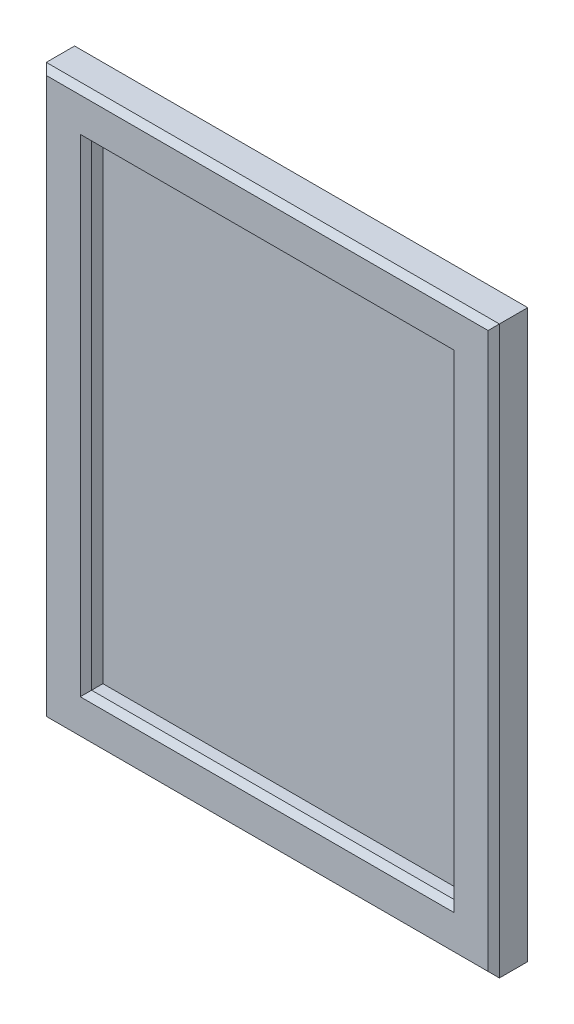
ISO-10303-21;
HEADER;
FILE_DESCRIPTION(('STEP AP214'),'2;1');
FILE_NAME('part.step','',(''),(''),'','','');
FILE_SCHEMA(('AUTOMOTIVE_DESIGN { 1 0 10303 214 1 1 1 1 }'));
ENDSEC;
DATA;
#1=APPLICATION_CONTEXT('core data for automotive mechanical design processes');
#2=APPLICATION_PROTOCOL_DEFINITION('international standard','automotive_design',2000,#1);
#3=PRODUCT_CONTEXT('',#1,'mechanical');
#4=PRODUCT('Part','Part','',(#3));
#5=PRODUCT_RELATED_PRODUCT_CATEGORY('part','',(#4));
#6=PRODUCT_DEFINITION_FORMATION('','',#4);
#7=PRODUCT_DEFINITION_CONTEXT('part definition',#1,'design');
#8=PRODUCT_DEFINITION('design','',#6,#7);
#9=PRODUCT_DEFINITION_SHAPE('','',#8);
#10=(LENGTH_UNIT() NAMED_UNIT(*) SI_UNIT(.MILLI.,.METRE.));
#11=(NAMED_UNIT(*) PLANE_ANGLE_UNIT() SI_UNIT($,.RADIAN.));
#12=(NAMED_UNIT(*) SI_UNIT($,.STERADIAN.) SOLID_ANGLE_UNIT());
#13=UNCERTAINTY_MEASURE_WITH_UNIT(LENGTH_MEASURE(1.E-05),#10,'distance_accuracy_value','');
#14=(GEOMETRIC_REPRESENTATION_CONTEXT(3) GLOBAL_UNCERTAINTY_ASSIGNED_CONTEXT((#13)) GLOBAL_UNIT_ASSIGNED_CONTEXT((#10,
#11,#12)) REPRESENTATION_CONTEXT('',''));
#15=CARTESIAN_POINT('',(0.,0.,0.));
#16=DIRECTION('',(0.,0.,1.));
#17=DIRECTION('',(1.,0.,0.));
#18=AXIS2_PLACEMENT_3D('',#15,#16,#17);
#19=CARTESIAN_POINT('',(737.309711458083,953.456875401663,30.));
#20=DIRECTION('',(1.,0.,0.));
#21=DIRECTION('',(0.,1.,0.));
#22=AXIS2_PLACEMENT_3D('',#19,#20,#21);
#23=PLANE('',#22);
#24=DIRECTION('',(0.,-1.,0.));
#25=VECTOR('',#24,1.);
#26=CARTESIAN_POINT('',(737.309711458083,953.456875401663,20.));
#27=LINE('',#26,#25);
#28=CARTESIAN_POINT('',(737.309711458083,953.456875401663,20.));
#29=VERTEX_POINT('',#28);
#30=CARTESIAN_POINT('',(737.309711458083,37.5133814701847,20.));
#31=VERTEX_POINT('',#30);
#32=EDGE_CURVE('E119',#29,#31,#27,.T.);
#33=ORIENTED_EDGE('',*,*,#32,.F.);
#34=DIRECTION('',(0.,0.,-1.));
#35=VECTOR('',#34,1.);
#36=CARTESIAN_POINT('',(737.309711458083,953.456875401663,30.));
#37=LINE('',#36,#35);
#38=CARTESIAN_POINT('',(737.309711458083,953.456875401663,30.));
#39=VERTEX_POINT('',#38);
#40=EDGE_CURVE('E12',#39,#29,#37,.T.);
#41=ORIENTED_EDGE('',*,*,#40,.F.);
#42=DIRECTION('',(0.,-1.,0.));
#43=VECTOR('',#42,1.);
#44=CARTESIAN_POINT('',(737.309711458083,953.456875401663,30.));
#45=LINE('',#44,#43);
#46=CARTESIAN_POINT('',(737.309711458083,37.5133814701847,30.));
#47=VERTEX_POINT('',#46);
#48=EDGE_CURVE('E113',#39,#47,#45,.T.);
#49=ORIENTED_EDGE('',*,*,#48,.T.);
#50=DIRECTION('',(0.,0.,-1.));
#51=VECTOR('',#50,1.);
#52=CARTESIAN_POINT('',(737.309711458083,37.5133814701847,30.));
#53=LINE('',#52,#51);
#54=EDGE_CURVE('E58',#47,#31,#53,.T.);
#55=ORIENTED_EDGE('',*,*,#54,.T.);
#56=EDGE_LOOP('',(#33,#41,#49,#55));
#57=FACE_BOUND('',#56,.T.);
#58=ADVANCED_FACE('F55',(#57),#23,.T.);
#59=CARTESIAN_POINT('',(737.309711458083,953.456875401663,30.));
#60=DIRECTION('',(0.,1.,0.));
#61=DIRECTION('',(0.,0.,1.));
#62=AXIS2_PLACEMENT_3D('',#59,#60,#61);
#63=PLANE('',#62);
#64=DIRECTION('',(1.,0.,0.));
#65=VECTOR('',#64,1.);
#66=CARTESIAN_POINT('',(737.309711458083,953.456875401663,20.));
#67=LINE('',#66,#65);
#68=CARTESIAN_POINT('',(41.8597438026764,953.456875401663,20.));
#69=VERTEX_POINT('',#68);
#70=EDGE_CURVE('E115',#69,#29,#67,.T.);
#71=ORIENTED_EDGE('',*,*,#70,.F.);
#72=DIRECTION('',(0.,0.,-1.));
#73=VECTOR('',#72,1.);
#74=CARTESIAN_POINT('',(41.8597438026764,953.456875401663,30.));
#75=LINE('',#74,#73);
#76=CARTESIAN_POINT('',(41.8597438026764,953.456875401663,30.));
#77=VERTEX_POINT('',#76);
#78=EDGE_CURVE('E64',#77,#69,#75,.T.);
#79=ORIENTED_EDGE('',*,*,#78,.F.);
#80=DIRECTION('',(1.,0.,0.));
#81=VECTOR('',#80,1.);
#82=CARTESIAN_POINT('',(737.309711458083,953.456875401663,30.));
#83=LINE('',#82,#81);
#84=EDGE_CURVE('E110',#77,#39,#83,.T.);
#85=ORIENTED_EDGE('',*,*,#84,.T.);
#86=ORIENTED_EDGE('',*,*,#40,.T.);
#87=EDGE_LOOP('',(#71,#79,#85,#86));
#88=FACE_BOUND('',#87,.T.);
#89=ADVANCED_FACE('F129',(#88),#63,.T.);
#90=CARTESIAN_POINT('',(41.8597438026764,953.456875401663,30.));
#91=DIRECTION('',(-1.,0.,0.));
#92=DIRECTION('',(0.,0.,1.));
#93=AXIS2_PLACEMENT_3D('',#90,#91,#92);
#94=PLANE('',#93);
#95=DIRECTION('',(0.,1.,0.));
#96=VECTOR('',#95,1.);
#97=CARTESIAN_POINT('',(41.8597438026764,953.456875401663,20.));
#98=LINE('',#97,#96);
#99=CARTESIAN_POINT('',(41.8597438026764,37.5133814701847,20.));
#100=VERTEX_POINT('',#99);
#101=EDGE_CURVE('E105',#100,#69,#98,.T.);
#102=ORIENTED_EDGE('',*,*,#101,.F.);
#103=DIRECTION('',(0.,0.,-1.));
#104=VECTOR('',#103,1.);
#105=CARTESIAN_POINT('',(41.8597438026764,37.5133814701847,30.));
#106=LINE('',#105,#104);
#107=CARTESIAN_POINT('',(41.8597438026764,37.5133814701847,30.));
#108=VERTEX_POINT('',#107);
#109=EDGE_CURVE('E100',#108,#100,#106,.T.);
#110=ORIENTED_EDGE('',*,*,#109,.F.);
#111=DIRECTION('',(0.,1.,0.));
#112=VECTOR('',#111,1.);
#113=CARTESIAN_POINT('',(41.8597438026764,953.456875401663,30.));
#114=LINE('',#113,#112);
#115=EDGE_CURVE('E103',#108,#77,#114,.T.);
#116=ORIENTED_EDGE('',*,*,#115,.T.);
#117=ORIENTED_EDGE('',*,*,#78,.T.);
#118=EDGE_LOOP('',(#102,#110,#116,#117));
#119=FACE_BOUND('',#118,.T.);
#120=ADVANCED_FACE('F102',(#119),#94,.T.);
#121=CARTESIAN_POINT('',(737.309711458083,37.5133814701847,30.));
#122=DIRECTION('',(0.,-1.,0.));
#123=DIRECTION('',(0.,0.,-1.));
#124=AXIS2_PLACEMENT_3D('',#121,#122,#123);
#125=PLANE('',#124);
#126=DIRECTION('',(-1.,0.,0.));
#127=VECTOR('',#126,1.);
#128=CARTESIAN_POINT('',(737.309711458083,37.5133814701847,20.));
#129=LINE('',#128,#127);
#130=EDGE_CURVE('E122',#31,#100,#129,.T.);
#131=ORIENTED_EDGE('',*,*,#130,.F.);
#132=ORIENTED_EDGE('',*,*,#54,.F.);
#133=DIRECTION('',(-1.,0.,0.));
#134=VECTOR('',#133,1.);
#135=CARTESIAN_POINT('',(737.309711458083,37.5133814701847,30.));
#136=LINE('',#135,#134);
#137=EDGE_CURVE('E109',#47,#108,#136,.T.);
#138=ORIENTED_EDGE('',*,*,#137,.T.);
#139=ORIENTED_EDGE('',*,*,#109,.T.);
#140=EDGE_LOOP('',(#131,#132,#138,#139));
#141=FACE_BOUND('',#140,.T.);
#142=ADVANCED_FACE('F112',(#141),#125,.T.);
#143=CARTESIAN_POINT('',(0.,0.,30.));
#144=DIRECTION('',(0.,0.,-1.));
#145=DIRECTION('',(-1.,0.,0.));
#146=AXIS2_PLACEMENT_3D('',#143,#144,#145);
#147=PLANE('',#146);
#148=ORIENTED_EDGE('',*,*,#48,.F.);
#149=ORIENTED_EDGE('',*,*,#84,.F.);
#150=ORIENTED_EDGE('',*,*,#115,.F.);
#151=ORIENTED_EDGE('',*,*,#137,.F.);
#152=EDGE_LOOP('',(#148,#149,#150,#151));
#153=FACE_BOUND('',#152,.T.);
#154=ADVANCED_FACE('F108',(#153),#147,.F.);
#155=CARTESIAN_POINT('',(0.,0.,20.));
#156=DIRECTION('',(0.,0.,-1.));
#157=DIRECTION('',(-1.,0.,0.));
#158=AXIS2_PLACEMENT_3D('',#155,#156,#157);
#159=PLANE('',#158);
#160=ORIENTED_EDGE('',*,*,#32,.T.);
#161=ORIENTED_EDGE('',*,*,#130,.T.);
#162=ORIENTED_EDGE('',*,*,#101,.T.);
#163=ORIENTED_EDGE('',*,*,#70,.T.);
#164=EDGE_LOOP('',(#160,#161,#162,#163));
#165=FACE_BOUND('',#164,.T.);
#166=ADVANCED_FACE('F128',(#165),#159,.T.);
#167=CLOSED_SHELL('',(#58,#89,#120,#142,#154,#166));
#168=MANIFOLD_SOLID_BREP('B2',#167);
#169=CARTESIAN_POINT('',(0.,0.,60.));
#170=DIRECTION('',(0.,0.,-1.));
#171=DIRECTION('',(-1.,0.,0.));
#172=AXIS2_PLACEMENT_3D('',#169,#170,#171);
#173=PLANE('',#172);
#174=DIRECTION('',(1.,0.,0.));
#175=VECTOR('',#174,1.);
#176=CARTESIAN_POINT('',(720.,930.,60.));
#177=LINE('',#176,#175);
#178=CARTESIAN_POINT('',(69.9999999999998,930.,60.));
#179=VERTEX_POINT('',#178);
#180=CARTESIAN_POINT('',(730.,930.,60.));
#181=VERTEX_POINT('',#180);
#182=EDGE_CURVE('E344',#179,#181,#177,.T.);
#183=ORIENTED_EDGE('',*,*,#182,.T.);
#184=DIRECTION('',(0.,-1.,0.));
#185=VECTOR('',#184,1.);
#186=CARTESIAN_POINT('',(730.,80.,60.));
#187=LINE('',#186,#185);
#188=CARTESIAN_POINT('',(730.,69.9999999999998,60.));
#189=VERTEX_POINT('',#188);
#190=EDGE_CURVE('E346',#181,#189,#187,.T.);
#191=ORIENTED_EDGE('',*,*,#190,.T.);
#192=DIRECTION('',(-1.,0.,0.));
#193=VECTOR('',#192,1.);
#194=CARTESIAN_POINT('',(80.,69.9999999999998,60.));
#195=LINE('',#194,#193);
#196=CARTESIAN_POINT('',(69.9999999999998,69.9999999999998,60.));
#197=VERTEX_POINT('',#196);
#198=EDGE_CURVE('E340',#189,#197,#195,.T.);
#199=ORIENTED_EDGE('',*,*,#198,.T.);
#200=DIRECTION('',(0.,1.,0.));
#201=VECTOR('',#200,1.);
#202=CARTESIAN_POINT('',(69.9999999999998,920.,60.));
#203=LINE('',#202,#201);
#204=EDGE_CURVE('E342',#197,#179,#203,.T.);
#205=ORIENTED_EDGE('',*,*,#204,.T.);
#206=EDGE_LOOP('',(#183,#191,#199,#205));
#207=FACE_BOUND('',#206,.T.);
#208=DIRECTION('',(0.,1.,0.));
#209=VECTOR('',#208,1.);
#210=CARTESIAN_POINT('',(790.,0.,60.));
#211=LINE('',#210,#209);
#212=CARTESIAN_POINT('',(790.,10.0000000000001,60.));
#213=VERTEX_POINT('',#212);
#214=CARTESIAN_POINT('',(790.,990.,60.));
#215=VERTEX_POINT('',#214);
#216=EDGE_CURVE('E335',#213,#215,#211,.T.);
#217=ORIENTED_EDGE('',*,*,#216,.T.);
#218=DIRECTION('',(-1.,0.,0.));
#219=VECTOR('',#218,1.);
#220=CARTESIAN_POINT('',(0.,990.,60.));
#221=LINE('',#220,#219);
#222=CARTESIAN_POINT('',(10.0000000000001,990.,60.));
#223=VERTEX_POINT('',#222);
#224=EDGE_CURVE('E337',#215,#223,#221,.T.);
#225=ORIENTED_EDGE('',*,*,#224,.T.);
#226=DIRECTION('',(0.,-1.,0.));
#227=VECTOR('',#226,1.);
#228=CARTESIAN_POINT('',(10.0000000000001,0.,60.));
#229=LINE('',#228,#227);
#230=CARTESIAN_POINT('',(10.0000000000001,10.0000000000001,60.));
#231=VERTEX_POINT('',#230);
#232=EDGE_CURVE('E331',#223,#231,#229,.T.);
#233=ORIENTED_EDGE('',*,*,#232,.T.);
#234=DIRECTION('',(1.,0.,0.));
#235=VECTOR('',#234,1.);
#236=CARTESIAN_POINT('',(0.,10.0000000000001,60.));
#237=LINE('',#236,#235);
#238=EDGE_CURVE('E333',#231,#213,#237,.T.);
#239=ORIENTED_EDGE('',*,*,#238,.T.);
#240=EDGE_LOOP('',(#217,#225,#233,#239));
#241=FACE_BOUND('',#240,.T.);
#242=ADVANCED_FACE('F179',(#207,#241),#173,.F.);
#243=CARTESIAN_POINT('',(0.,0.,0.));
#244=DIRECTION('',(0.,0.,-1.));
#245=DIRECTION('',(-1.,0.,0.));
#246=AXIS2_PLACEMENT_3D('',#243,#244,#245);
#247=PLANE('',#246);
#248=DIRECTION('',(0.,-1.,0.));
#249=VECTOR('',#248,1.);
#250=CARTESIAN_POINT('',(0.,0.,0.));
#251=LINE('',#250,#249);
#252=CARTESIAN_POINT('',(0.,1000.,0.));
#253=VERTEX_POINT('',#252);
#254=CARTESIAN_POINT('',(0.,0.,0.));
#255=VERTEX_POINT('',#254);
#256=EDGE_CURVE('E282',#253,#255,#251,.T.);
#257=ORIENTED_EDGE('',*,*,#256,.F.);
#258=DIRECTION('',(-1.,0.,0.));
#259=VECTOR('',#258,1.);
#260=CARTESIAN_POINT('',(0.,1000.,0.));
#261=LINE('',#260,#259);
#262=CARTESIAN_POINT('',(800.,1000.,0.));
#263=VERTEX_POINT('',#262);
#264=EDGE_CURVE('E318',#263,#253,#261,.T.);
#265=ORIENTED_EDGE('',*,*,#264,.F.);
#266=DIRECTION('',(0.,1.,0.));
#267=VECTOR('',#266,1.);
#268=CARTESIAN_POINT('',(800.,0.,0.));
#269=LINE('',#268,#267);
#270=CARTESIAN_POINT('',(800.,0.,0.));
#271=VERTEX_POINT('',#270);
#272=EDGE_CURVE('E315',#271,#263,#269,.T.);
#273=ORIENTED_EDGE('',*,*,#272,.F.);
#274=DIRECTION('',(1.,0.,0.));
#275=VECTOR('',#274,1.);
#276=CARTESIAN_POINT('',(0.,0.,0.));
#277=LINE('',#276,#275);
#278=EDGE_CURVE('E312',#255,#271,#277,.T.);
#279=ORIENTED_EDGE('',*,*,#278,.F.);
#280=EDGE_LOOP('',(#257,#265,#273,#279));
#281=FACE_BOUND('',#280,.T.);
#282=DIRECTION('',(0.,-1.,0.));
#283=VECTOR('',#282,1.);
#284=CARTESIAN_POINT('',(80.,80.,0.));
#285=LINE('',#284,#283);
#286=CARTESIAN_POINT('',(80.,920.,0.));
#287=VERTEX_POINT('',#286);
#288=CARTESIAN_POINT('',(80.,80.,0.));
#289=VERTEX_POINT('',#288);
#290=EDGE_CURVE('E296',#287,#289,#285,.T.);
#291=ORIENTED_EDGE('',*,*,#290,.T.);
#292=DIRECTION('',(1.,0.,0.));
#293=VECTOR('',#292,1.);
#294=CARTESIAN_POINT('',(80.,80.,0.));
#295=LINE('',#294,#293);
#296=CARTESIAN_POINT('',(720.,80.,0.));
#297=VERTEX_POINT('',#296);
#298=EDGE_CURVE('E275',#289,#297,#295,.T.);
#299=ORIENTED_EDGE('',*,*,#298,.T.);
#300=DIRECTION('',(0.,1.,0.));
#301=VECTOR('',#300,1.);
#302=CARTESIAN_POINT('',(720.,80.,0.));
#303=LINE('',#302,#301);
#304=CARTESIAN_POINT('',(720.,920.,0.));
#305=VERTEX_POINT('',#304);
#306=EDGE_CURVE('E286',#297,#305,#303,.T.);
#307=ORIENTED_EDGE('',*,*,#306,.T.);
#308=DIRECTION('',(-1.,0.,0.));
#309=VECTOR('',#308,1.);
#310=CARTESIAN_POINT('',(80.,920.,0.));
#311=LINE('',#310,#309);
#312=EDGE_CURVE('E292',#305,#287,#311,.T.);
#313=ORIENTED_EDGE('',*,*,#312,.T.);
#314=EDGE_LOOP('',(#291,#299,#307,#313));
#315=FACE_BOUND('',#314,.T.);
#316=ADVANCED_FACE('F294',(#281,#315),#247,.T.);
#317=CARTESIAN_POINT('',(0.,0.,60.));
#318=DIRECTION('',(1.,0.,0.));
#319=DIRECTION('',(0.,0.,-1.));
#320=AXIS2_PLACEMENT_3D('',#317,#318,#319);
#321=PLANE('',#320);
#322=DIRECTION('',(0.,0.,-1.));
#323=VECTOR('',#322,1.);
#324=CARTESIAN_POINT('',(0.,0.,60.));
#325=LINE('',#324,#323);
#326=CARTESIAN_POINT('',(0.,0.,50.));
#327=VERTEX_POINT('',#326);
#328=EDGE_CURVE('E327',#327,#255,#325,.T.);
#329=ORIENTED_EDGE('',*,*,#328,.F.);
#330=DIRECTION('',(0.,1.,0.));
#331=VECTOR('',#330,1.);
#332=CARTESIAN_POINT('',(0.,0.,50.));
#333=LINE('',#332,#331);
#334=CARTESIAN_POINT('',(0.,1000.,50.));
#335=VERTEX_POINT('',#334);
#336=EDGE_CURVE('E53',#327,#335,#333,.T.);
#337=ORIENTED_EDGE('',*,*,#336,.T.);
#338=DIRECTION('',(0.,0.,-1.));
#339=VECTOR('',#338,1.);
#340=CARTESIAN_POINT('',(0.,1000.,60.));
#341=LINE('',#340,#339);
#342=EDGE_CURVE('E321',#335,#253,#341,.T.);
#343=ORIENTED_EDGE('',*,*,#342,.T.);
#344=ORIENTED_EDGE('',*,*,#256,.T.);
#345=EDGE_LOOP('',(#329,#337,#343,#344));
#346=FACE_BOUND('',#345,.T.);
#347=ADVANCED_FACE('F386',(#346),#321,.F.);
#348=CARTESIAN_POINT('',(0.,0.,60.));
#349=DIRECTION('',(0.,1.,0.));
#350=DIRECTION('',(0.,0.,1.));
#351=AXIS2_PLACEMENT_3D('',#348,#349,#350);
#352=PLANE('',#351);
#353=DIRECTION('',(0.,0.,-1.));
#354=VECTOR('',#353,1.);
#355=CARTESIAN_POINT('',(800.,0.,60.));
#356=LINE('',#355,#354);
#357=CARTESIAN_POINT('',(800.,0.,50.));
#358=VERTEX_POINT('',#357);
#359=EDGE_CURVE('E325',#358,#271,#356,.T.);
#360=ORIENTED_EDGE('',*,*,#359,.F.);
#361=DIRECTION('',(-1.,0.,0.));
#362=VECTOR('',#361,1.);
#363=CARTESIAN_POINT('',(0.,0.,50.));
#364=LINE('',#363,#362);
#365=EDGE_CURVE('E189',#358,#327,#364,.T.);
#366=ORIENTED_EDGE('',*,*,#365,.T.);
#367=ORIENTED_EDGE('',*,*,#328,.T.);
#368=ORIENTED_EDGE('',*,*,#278,.T.);
#369=EDGE_LOOP('',(#360,#366,#367,#368));
#370=FACE_BOUND('',#369,.T.);
#371=ADVANCED_FACE('F413',(#370),#352,.F.);
#372=CARTESIAN_POINT('',(800.,0.,60.));
#373=DIRECTION('',(-1.,0.,0.));
#374=DIRECTION('',(0.,0.,1.));
#375=AXIS2_PLACEMENT_3D('',#372,#373,#374);
#376=PLANE('',#375);
#377=DIRECTION('',(0.,0.,-1.));
#378=VECTOR('',#377,1.);
#379=CARTESIAN_POINT('',(800.,1000.,60.));
#380=LINE('',#379,#378);
#381=CARTESIAN_POINT('',(800.,1000.,50.));
#382=VERTEX_POINT('',#381);
#383=EDGE_CURVE('E323',#382,#263,#380,.T.);
#384=ORIENTED_EDGE('',*,*,#383,.F.);
#385=DIRECTION('',(0.,-1.,0.));
#386=VECTOR('',#385,1.);
#387=CARTESIAN_POINT('',(800.,0.,50.));
#388=LINE('',#387,#386);
#389=EDGE_CURVE('E204',#382,#358,#388,.T.);
#390=ORIENTED_EDGE('',*,*,#389,.T.);
#391=ORIENTED_EDGE('',*,*,#359,.T.);
#392=ORIENTED_EDGE('',*,*,#272,.T.);
#393=EDGE_LOOP('',(#384,#390,#391,#392));
#394=FACE_BOUND('',#393,.T.);
#395=ADVANCED_FACE('F410',(#394),#376,.F.);
#396=CARTESIAN_POINT('',(0.,1000.,60.));
#397=DIRECTION('',(0.,-1.,0.));
#398=DIRECTION('',(0.,0.,-1.));
#399=AXIS2_PLACEMENT_3D('',#396,#397,#398);
#400=PLANE('',#399);
#401=ORIENTED_EDGE('',*,*,#342,.F.);
#402=DIRECTION('',(1.,0.,0.));
#403=VECTOR('',#402,1.);
#404=CARTESIAN_POINT('',(0.,1000.,50.));
#405=LINE('',#404,#403);
#406=EDGE_CURVE('E354',#335,#382,#405,.T.);
#407=ORIENTED_EDGE('',*,*,#406,.T.);
#408=ORIENTED_EDGE('',*,*,#383,.T.);
#409=ORIENTED_EDGE('',*,*,#264,.T.);
#410=EDGE_LOOP('',(#401,#407,#408,#409));
#411=FACE_BOUND('',#410,.T.);
#412=ADVANCED_FACE('F389',(#411),#400,.F.);
#413=CARTESIAN_POINT('',(80.,80.,60.));
#414=DIRECTION('',(0.,1.,0.));
#415=DIRECTION('',(0.,0.,1.));
#416=AXIS2_PLACEMENT_3D('',#413,#414,#415);
#417=PLANE('',#416);
#418=DIRECTION('',(0.,0.,-1.));
#419=VECTOR('',#418,1.);
#420=CARTESIAN_POINT('',(80.,80.,60.));
#421=LINE('',#420,#419);
#422=CARTESIAN_POINT('',(80.,80.,49.9999999999998));
#423=VERTEX_POINT('',#422);
#424=EDGE_CURVE('E305',#423,#289,#421,.T.);
#425=ORIENTED_EDGE('',*,*,#424,.F.);
#426=DIRECTION('',(1.,0.,0.));
#427=VECTOR('',#426,1.);
#428=CARTESIAN_POINT('',(720.,80.,49.9999999999998));
#429=LINE('',#428,#427);
#430=CARTESIAN_POINT('',(720.,80.,49.9999999999998));
#431=VERTEX_POINT('',#430);
#432=EDGE_CURVE('E278',#423,#431,#429,.T.);
#433=ORIENTED_EDGE('',*,*,#432,.T.);
#434=DIRECTION('',(0.,0.,-1.));
#435=VECTOR('',#434,1.);
#436=CARTESIAN_POINT('',(720.,80.,60.));
#437=LINE('',#436,#435);
#438=EDGE_CURVE('E270',#431,#297,#437,.T.);
#439=ORIENTED_EDGE('',*,*,#438,.T.);
#440=ORIENTED_EDGE('',*,*,#298,.F.);
#441=EDGE_LOOP('',(#425,#433,#439,#440));
#442=FACE_BOUND('',#441,.T.);
#443=ADVANCED_FACE('F273',(#442),#417,.T.);
#444=CARTESIAN_POINT('',(720.,80.,60.));
#445=DIRECTION('',(-1.,0.,0.));
#446=DIRECTION('',(0.,0.,1.));
#447=AXIS2_PLACEMENT_3D('',#444,#445,#446);
#448=PLANE('',#447);
#449=ORIENTED_EDGE('',*,*,#438,.F.);
#450=DIRECTION('',(0.,1.,0.));
#451=VECTOR('',#450,1.);
#452=CARTESIAN_POINT('',(720.,920.,49.9999999999998));
#453=LINE('',#452,#451);
#454=CARTESIAN_POINT('',(720.,920.,49.9999999999998));
#455=VERTEX_POINT('',#454);
#456=EDGE_CURVE('E329',#431,#455,#453,.T.);
#457=ORIENTED_EDGE('',*,*,#456,.T.);
#458=DIRECTION('',(0.,0.,-1.));
#459=VECTOR('',#458,1.);
#460=CARTESIAN_POINT('',(720.,920.,60.));
#461=LINE('',#460,#459);
#462=EDGE_CURVE('E283',#455,#305,#461,.T.);
#463=ORIENTED_EDGE('',*,*,#462,.T.);
#464=ORIENTED_EDGE('',*,*,#306,.F.);
#465=EDGE_LOOP('',(#449,#457,#463,#464));
#466=FACE_BOUND('',#465,.T.);
#467=ADVANCED_FACE('F287',(#466),#448,.T.);
#468=CARTESIAN_POINT('',(80.,920.,60.));
#469=DIRECTION('',(0.,-1.,0.));
#470=DIRECTION('',(0.,0.,-1.));
#471=AXIS2_PLACEMENT_3D('',#468,#469,#470);
#472=PLANE('',#471);
#473=ORIENTED_EDGE('',*,*,#462,.F.);
#474=DIRECTION('',(-1.,0.,0.));
#475=VECTOR('',#474,1.);
#476=CARTESIAN_POINT('',(80.,920.,49.9999999999998));
#477=LINE('',#476,#475);
#478=CARTESIAN_POINT('',(80.,920.,49.9999999999998));
#479=VERTEX_POINT('',#478);
#480=EDGE_CURVE('E349',#455,#479,#477,.T.);
#481=ORIENTED_EDGE('',*,*,#480,.T.);
#482=DIRECTION('',(0.,0.,-1.));
#483=VECTOR('',#482,1.);
#484=CARTESIAN_POINT('',(80.,920.,60.));
#485=LINE('',#484,#483);
#486=EDGE_CURVE('E307',#479,#287,#485,.T.);
#487=ORIENTED_EDGE('',*,*,#486,.T.);
#488=ORIENTED_EDGE('',*,*,#312,.F.);
#489=EDGE_LOOP('',(#473,#481,#487,#488));
#490=FACE_BOUND('',#489,.T.);
#491=ADVANCED_FACE('F491',(#490),#472,.T.);
#492=CARTESIAN_POINT('',(80.,80.,60.));
#493=DIRECTION('',(1.,0.,0.));
#494=DIRECTION('',(0.,0.,-1.));
#495=AXIS2_PLACEMENT_3D('',#492,#493,#494);
#496=PLANE('',#495);
#497=ORIENTED_EDGE('',*,*,#486,.F.);
#498=DIRECTION('',(0.,-1.,0.));
#499=VECTOR('',#498,1.);
#500=CARTESIAN_POINT('',(80.,80.,49.9999999999998));
#501=LINE('',#500,#499);
#502=EDGE_CURVE('E351',#479,#423,#501,.T.);
#503=ORIENTED_EDGE('',*,*,#502,.T.);
#504=ORIENTED_EDGE('',*,*,#424,.T.);
#505=ORIENTED_EDGE('',*,*,#290,.F.);
#506=EDGE_LOOP('',(#497,#503,#504,#505));
#507=FACE_BOUND('',#506,.T.);
#508=ADVANCED_FACE('F444',(#507),#496,.T.);
#509=CARTESIAN_POINT('',(80.,80.,49.9999999999998));
#510=DIRECTION('',(0.707106781186548,0.,0.707106781186548));
#511=DIRECTION('',(0.,1.,0.));
#512=AXIS2_PLACEMENT_3D('',#509,#510,#511);
#513=PLANE('',#512);
#514=DIRECTION('',(-0.577350269189626,0.577350269189626,0.577350269189626));
#515=VECTOR('',#514,1.);
#516=CARTESIAN_POINT('',(80.,920.,49.9999999999998));
#517=LINE('',#516,#515);
#518=EDGE_CURVE('E300',#179,#479,#517,.F.);
#519=ORIENTED_EDGE('',*,*,#518,.F.);
#520=ORIENTED_EDGE('',*,*,#204,.F.);
#521=DIRECTION('',(-0.577350269189626,-0.577350269189626,0.577350269189626));
#522=VECTOR('',#521,1.);
#523=CARTESIAN_POINT('',(80.,80.,49.9999999999998));
#524=LINE('',#523,#522);
#525=EDGE_CURVE('E297',#423,#197,#524,.T.);
#526=ORIENTED_EDGE('',*,*,#525,.F.);
#527=ORIENTED_EDGE('',*,*,#502,.F.);
#528=EDGE_LOOP('',(#519,#520,#526,#527));
#529=FACE_BOUND('',#528,.T.);
#530=ADVANCED_FACE('F438',(#529),#513,.T.);
#531=CARTESIAN_POINT('',(80.,80.,49.9999999999998));
#532=DIRECTION('',(0.,0.707106781186548,0.707106781186548));
#533=DIRECTION('',(-1.,0.,0.));
#534=AXIS2_PLACEMENT_3D('',#531,#532,#533);
#535=PLANE('',#534);
#536=ORIENTED_EDGE('',*,*,#525,.T.);
#537=ORIENTED_EDGE('',*,*,#198,.F.);
#538=DIRECTION('',(-0.577350269189626,0.577350269189626,-0.577350269189626));
#539=VECTOR('',#538,1.);
#540=CARTESIAN_POINT('',(720.,80.,49.9999999999998));
#541=LINE('',#540,#539);
#542=EDGE_CURVE('E361',#431,#189,#541,.F.);
#543=ORIENTED_EDGE('',*,*,#542,.F.);
#544=ORIENTED_EDGE('',*,*,#432,.F.);
#545=EDGE_LOOP('',(#536,#537,#543,#544));
#546=FACE_BOUND('',#545,.T.);
#547=ADVANCED_FACE('F431',(#546),#535,.T.);
#548=CARTESIAN_POINT('',(80.,920.,49.9999999999998));
#549=DIRECTION('',(0.,-0.707106781186548,0.707106781186548));
#550=DIRECTION('',(1.,0.,0.));
#551=AXIS2_PLACEMENT_3D('',#548,#549,#550);
#552=PLANE('',#551);
#553=ORIENTED_EDGE('',*,*,#518,.T.);
#554=ORIENTED_EDGE('',*,*,#480,.F.);
#555=DIRECTION('',(0.577350269189626,0.577350269189626,0.577350269189626));
#556=VECTOR('',#555,1.);
#557=CARTESIAN_POINT('',(440.,640.,-230.));
#558=LINE('',#557,#556);
#559=EDGE_CURVE('E359',#181,#455,#558,.F.);
#560=ORIENTED_EDGE('',*,*,#559,.F.);
#561=ORIENTED_EDGE('',*,*,#182,.F.);
#562=EDGE_LOOP('',(#553,#554,#560,#561));
#563=FACE_BOUND('',#562,.T.);
#564=ADVANCED_FACE('F424',(#563),#552,.T.);
#565=CARTESIAN_POINT('',(720.,80.,49.9999999999998));
#566=DIRECTION('',(-0.707106781186548,0.,0.707106781186548));
#567=DIRECTION('',(0.,-1.,0.));
#568=AXIS2_PLACEMENT_3D('',#565,#566,#567);
#569=PLANE('',#568);
#570=ORIENTED_EDGE('',*,*,#542,.T.);
#571=ORIENTED_EDGE('',*,*,#190,.F.);
#572=ORIENTED_EDGE('',*,*,#559,.T.);
#573=ORIENTED_EDGE('',*,*,#456,.F.);
#574=EDGE_LOOP('',(#570,#571,#572,#573));
#575=FACE_BOUND('',#574,.T.);
#576=ADVANCED_FACE('F418',(#575),#569,.T.);
#577=CARTESIAN_POINT('',(0.,10.0000000000001,60.));
#578=DIRECTION('',(0.,0.707106781186544,-0.707106781186551));
#579=DIRECTION('',(1.,0.,0.));
#580=AXIS2_PLACEMENT_3D('',#577,#578,#579);
#581=PLANE('',#580);
#582=DIRECTION('',(0.577350269189628,0.577350269189628,0.577350269189622));
#583=VECTOR('',#582,1.);
#584=CARTESIAN_POINT('',(6.66666666666672,6.66666666666672,56.6666666666666));
#585=LINE('',#584,#583);
#586=EDGE_CURVE('E368',#327,#231,#585,.T.);
#587=ORIENTED_EDGE('',*,*,#586,.F.);
#588=ORIENTED_EDGE('',*,*,#365,.F.);
#589=DIRECTION('',(-0.577350269189628,0.577350269189628,0.577350269189622));
#590=VECTOR('',#589,1.);
#591=CARTESIAN_POINT('',(526.666666666664,273.333333333335,323.333333333332));
#592=LINE('',#591,#590);
#593=EDGE_CURVE('E184',#213,#358,#592,.F.);
#594=ORIENTED_EDGE('',*,*,#593,.F.);
#595=ORIENTED_EDGE('',*,*,#238,.F.);
#596=EDGE_LOOP('',(#587,#588,#594,#595));
#597=FACE_BOUND('',#596,.T.);
#598=ADVANCED_FACE('F182',(#597),#581,.F.);
#599=CARTESIAN_POINT('',(790.,0.,60.));
#600=DIRECTION('',(-0.707106781186543,0.,-0.707106781186551));
#601=DIRECTION('',(0.,1.,0.));
#602=AXIS2_PLACEMENT_3D('',#599,#600,#601);
#603=PLANE('',#602);
#604=ORIENTED_EDGE('',*,*,#593,.T.);
#605=ORIENTED_EDGE('',*,*,#389,.F.);
#606=DIRECTION('',(-0.577350269189628,-0.577350269189628,0.577350269189622));
#607=VECTOR('',#606,1.);
#608=CARTESIAN_POINT('',(459.999999999997,659.999999999998,389.999999999999));
#609=LINE('',#608,#607);
#610=EDGE_CURVE('E367',#215,#382,#609,.F.);
#611=ORIENTED_EDGE('',*,*,#610,.F.);
#612=ORIENTED_EDGE('',*,*,#216,.F.);
#613=EDGE_LOOP('',(#604,#605,#611,#612));
#614=FACE_BOUND('',#613,.T.);
#615=ADVANCED_FACE('F378',(#614),#603,.F.);
#616=CARTESIAN_POINT('',(10.0000000000001,0.,60.));
#617=DIRECTION('',(0.707106781186544,0.,-0.707106781186551));
#618=DIRECTION('',(0.,-1.,0.));
#619=AXIS2_PLACEMENT_3D('',#616,#617,#618);
#620=PLANE('',#619);
#621=ORIENTED_EDGE('',*,*,#586,.T.);
#622=ORIENTED_EDGE('',*,*,#232,.F.);
#623=DIRECTION('',(-0.577350269189628,0.577350269189628,-0.577350269189622));
#624=VECTOR('',#623,1.);
#625=CARTESIAN_POINT('',(340.000000000002,659.999999999997,389.999999999999));
#626=LINE('',#625,#624);
#627=EDGE_CURVE('E365',#335,#223,#626,.F.);
#628=ORIENTED_EDGE('',*,*,#627,.F.);
#629=ORIENTED_EDGE('',*,*,#336,.F.);
#630=EDGE_LOOP('',(#621,#622,#628,#629));
#631=FACE_BOUND('',#630,.T.);
#632=ADVANCED_FACE('F383',(#631),#620,.F.);
#633=CARTESIAN_POINT('',(0.,990.,60.));
#634=DIRECTION('',(0.,-0.707106781186543,-0.707106781186551));
#635=DIRECTION('',(-1.,0.,0.));
#636=AXIS2_PLACEMENT_3D('',#633,#634,#635);
#637=PLANE('',#636);
#638=ORIENTED_EDGE('',*,*,#610,.T.);
#639=ORIENTED_EDGE('',*,*,#406,.F.);
#640=ORIENTED_EDGE('',*,*,#627,.T.);
#641=ORIENTED_EDGE('',*,*,#224,.F.);
#642=EDGE_LOOP('',(#638,#639,#640,#641));
#643=FACE_BOUND('',#642,.T.);
#644=ADVANCED_FACE('F393',(#643),#637,.F.);
#645=CLOSED_SHELL('',(#242,#316,#347,#371,#395,#412,#443,#467,#491,#508,#530,#547,#564,#576,
#598,#615,#632,#644));
#646=MANIFOLD_SOLID_BREP('B6',#645);
#647=ADVANCED_BREP_SHAPE_REPRESENTATION('',(#18,#168,#646),#14);
#648=SHAPE_DEFINITION_REPRESENTATION(#9,#647);
ENDSEC;
END-ISO-10303-21;
